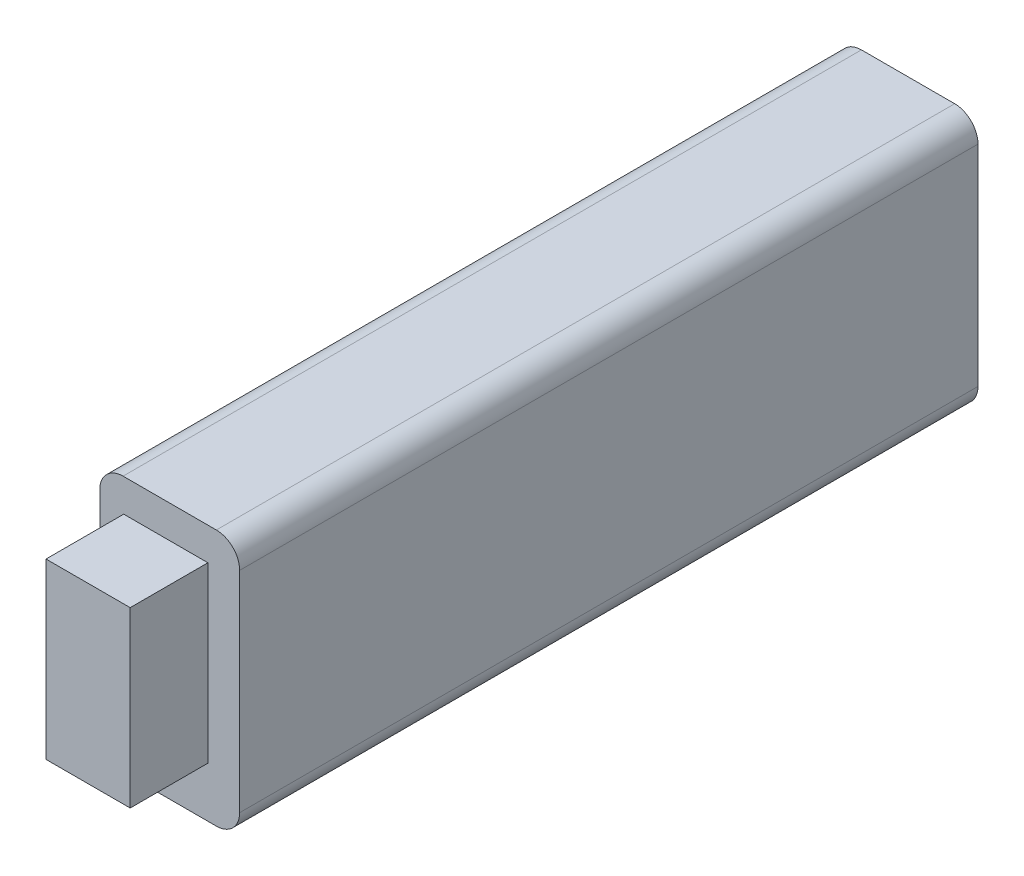
ISO-10303-21;
HEADER;
FILE_DESCRIPTION(('STEP AP214'),'2;1');
FILE_NAME('part.step','',(''),(''),'','','');
FILE_SCHEMA(('AUTOMOTIVE_DESIGN { 1 0 10303 214 1 1 1 1 }'));
ENDSEC;
DATA;
#1=APPLICATION_CONTEXT('core data for automotive mechanical design processes');
#2=APPLICATION_PROTOCOL_DEFINITION('international standard','automotive_design',2000,#1);
#3=PRODUCT_CONTEXT('',#1,'mechanical');
#4=PRODUCT('Part','Part','',(#3));
#5=PRODUCT_RELATED_PRODUCT_CATEGORY('part','',(#4));
#6=PRODUCT_DEFINITION_FORMATION('','',#4);
#7=PRODUCT_DEFINITION_CONTEXT('part definition',#1,'design');
#8=PRODUCT_DEFINITION('design','',#6,#7);
#9=PRODUCT_DEFINITION_SHAPE('','',#8);
#10=(LENGTH_UNIT() NAMED_UNIT(*) SI_UNIT(.MILLI.,.METRE.));
#11=(NAMED_UNIT(*) PLANE_ANGLE_UNIT() SI_UNIT($,.RADIAN.));
#12=(NAMED_UNIT(*) SI_UNIT($,.STERADIAN.) SOLID_ANGLE_UNIT());
#13=UNCERTAINTY_MEASURE_WITH_UNIT(LENGTH_MEASURE(1.E-05),#10,'distance_accuracy_value','');
#14=(GEOMETRIC_REPRESENTATION_CONTEXT(3) GLOBAL_UNCERTAINTY_ASSIGNED_CONTEXT((#13)) GLOBAL_UNIT_ASSIGNED_CONTEXT((#10,
#11,#12)) REPRESENTATION_CONTEXT('',''));
#15=CARTESIAN_POINT('',(0.,0.,0.));
#16=DIRECTION('',(0.,0.,1.));
#17=DIRECTION('',(1.,0.,0.));
#18=AXIS2_PLACEMENT_3D('',#15,#16,#17);
#19=CARTESIAN_POINT('',(18.,-16.5,47.5));
#20=DIRECTION('',(0.,0.,-1.));
#21=DIRECTION('',(-1.,0.,0.));
#22=AXIS2_PLACEMENT_3D('',#19,#20,#21);
#23=PLANE('',#22);
#24=DIRECTION('',(-1.,0.,0.));
#25=VECTOR('',#24,1.);
#26=CARTESIAN_POINT('',(18.,16.5,47.5));
#27=LINE('',#26,#25);
#28=CARTESIAN_POINT('',(15.,16.5,47.5));
#29=VERTEX_POINT('',#28);
#30=CARTESIAN_POINT('',(3.,16.5,47.5));
#31=VERTEX_POINT('',#30);
#32=EDGE_CURVE('E180',#29,#31,#27,.T.);
#33=ORIENTED_EDGE('',*,*,#32,.T.);
#34=CARTESIAN_POINT('',(3.,13.5,47.5));
#35=DIRECTION('',(0.,0.,-1.));
#36=DIRECTION('',(-1.,0.,0.));
#37=AXIS2_PLACEMENT_3D('',#34,#35,#36);
#38=CIRCLE('',#37,3.);
#39=CARTESIAN_POINT('',(0.,13.5,47.5));
#40=VERTEX_POINT('',#39);
#41=EDGE_CURVE('E197',#31,#40,#38,.F.);
#42=ORIENTED_EDGE('',*,*,#41,.T.);
#43=DIRECTION('',(0.,-1.,0.));
#44=VECTOR('',#43,1.);
#45=CARTESIAN_POINT('',(0.,-16.5,47.5));
#46=LINE('',#45,#44);
#47=CARTESIAN_POINT('',(0.,-13.5,47.5));
#48=VERTEX_POINT('',#47);
#49=EDGE_CURVE('E161',#40,#48,#46,.T.);
#50=ORIENTED_EDGE('',*,*,#49,.T.);
#51=CARTESIAN_POINT('',(3.,-13.5,47.5));
#52=DIRECTION('',(0.,0.,-1.));
#53=DIRECTION('',(-1.,0.,0.));
#54=AXIS2_PLACEMENT_3D('',#51,#52,#53);
#55=CIRCLE('',#54,3.);
#56=CARTESIAN_POINT('',(3.,-16.5,47.5));
#57=VERTEX_POINT('',#56);
#58=EDGE_CURVE('E191',#48,#57,#55,.F.);
#59=ORIENTED_EDGE('',*,*,#58,.T.);
#60=DIRECTION('',(-1.,0.,0.));
#61=VECTOR('',#60,1.);
#62=CARTESIAN_POINT('',(18.,-16.5,47.5));
#63=LINE('',#62,#61);
#64=CARTESIAN_POINT('',(15.,-16.5,47.5));
#65=VERTEX_POINT('',#64);
#66=EDGE_CURVE('E177',#65,#57,#63,.T.);
#67=ORIENTED_EDGE('',*,*,#66,.F.);
#68=CARTESIAN_POINT('',(15.,-13.5,47.5));
#69=DIRECTION('',(0.,0.,-1.));
#70=DIRECTION('',(-1.,0.,0.));
#71=AXIS2_PLACEMENT_3D('',#68,#69,#70);
#72=CIRCLE('',#71,3.);
#73=CARTESIAN_POINT('',(18.,-13.5,47.5));
#74=VERTEX_POINT('',#73);
#75=EDGE_CURVE('E193',#65,#74,#72,.F.);
#76=ORIENTED_EDGE('',*,*,#75,.T.);
#77=DIRECTION('',(0.,-1.,0.));
#78=VECTOR('',#77,1.);
#79=CARTESIAN_POINT('',(18.,-16.5,47.5));
#80=LINE('',#79,#78);
#81=CARTESIAN_POINT('',(18.,13.5,47.5));
#82=VERTEX_POINT('',#81);
#83=EDGE_CURVE('E168',#82,#74,#80,.T.);
#84=ORIENTED_EDGE('',*,*,#83,.F.);
#85=CARTESIAN_POINT('',(15.,13.5,47.5));
#86=DIRECTION('',(0.,0.,-1.));
#87=DIRECTION('',(-1.,0.,0.));
#88=AXIS2_PLACEMENT_3D('',#85,#86,#87);
#89=CIRCLE('',#88,3.);
#90=EDGE_CURVE('E192',#82,#29,#89,.F.);
#91=ORIENTED_EDGE('',*,*,#90,.T.);
#92=EDGE_LOOP('',(#33,#42,#50,#59,#67,#76,#84,#91));
#93=FACE_BOUND('',#92,.T.);
#94=DIRECTION('',(0.,-1.,0.));
#95=VECTOR('',#94,1.);
#96=CARTESIAN_POINT('',(3.08240215443334,12.3054774625952,47.5));
#97=LINE('',#96,#95);
#98=CARTESIAN_POINT('',(3.08240215443334,12.3054774625952,47.5));
#99=VERTEX_POINT('',#98);
#100=CARTESIAN_POINT('',(3.08240215443334,-10.0262530738284,47.5));
#101=VERTEX_POINT('',#100);
#102=EDGE_CURVE('E160',#99,#101,#97,.T.);
#103=ORIENTED_EDGE('',*,*,#102,.F.);
#104=DIRECTION('',(-1.,0.,0.));
#105=VECTOR('',#104,1.);
#106=CARTESIAN_POINT('',(3.08240215443334,12.3054774625952,47.5));
#107=LINE('',#106,#105);
#108=CARTESIAN_POINT('',(13.9142508564305,12.3054774625952,47.5));
#109=VERTEX_POINT('',#108);
#110=EDGE_CURVE('E152',#109,#99,#107,.T.);
#111=ORIENTED_EDGE('',*,*,#110,.F.);
#112=DIRECTION('',(0.,1.,0.));
#113=VECTOR('',#112,1.);
#114=CARTESIAN_POINT('',(13.9142508564305,12.3054774625952,47.5));
#115=LINE('',#114,#113);
#116=CARTESIAN_POINT('',(13.9142508564305,-10.0262530738284,47.5));
#117=VERTEX_POINT('',#116);
#118=EDGE_CURVE('E373',#117,#109,#115,.T.);
#119=ORIENTED_EDGE('',*,*,#118,.F.);
#120=DIRECTION('',(1.,0.,0.));
#121=VECTOR('',#120,1.);
#122=CARTESIAN_POINT('',(3.08240215443334,-10.0262530738284,47.5));
#123=LINE('',#122,#121);
#124=EDGE_CURVE('E377',#101,#117,#123,.T.);
#125=ORIENTED_EDGE('',*,*,#124,.F.);
#126=EDGE_LOOP('',(#103,#111,#119,#125));
#127=FACE_BOUND('',#126,.T.);
#128=ADVANCED_FACE('F45',(#93,#127),#23,.F.);
#129=CARTESIAN_POINT('',(18.,-16.5,-47.5));
#130=DIRECTION('',(0.,0.,1.));
#131=DIRECTION('',(1.,0.,0.));
#132=AXIS2_PLACEMENT_3D('',#129,#130,#131);
#133=PLANE('',#132);
#134=DIRECTION('',(0.,1.,0.));
#135=VECTOR('',#134,1.);
#136=CARTESIAN_POINT('',(0.,-16.5,-47.5));
#137=LINE('',#136,#135);
#138=CARTESIAN_POINT('',(0.,-13.5,-47.5));
#139=VERTEX_POINT('',#138);
#140=CARTESIAN_POINT('',(0.,13.5,-47.5));
#141=VERTEX_POINT('',#140);
#142=EDGE_CURVE('E158',#139,#141,#137,.T.);
#143=ORIENTED_EDGE('',*,*,#142,.T.);
#144=CARTESIAN_POINT('',(3.,13.5,-47.5));
#145=DIRECTION('',(0.,0.,1.));
#146=DIRECTION('',(1.,0.,0.));
#147=AXIS2_PLACEMENT_3D('',#144,#145,#146);
#148=CIRCLE('',#147,3.);
#149=CARTESIAN_POINT('',(3.,16.5,-47.5));
#150=VERTEX_POINT('',#149);
#151=EDGE_CURVE('E210',#141,#150,#148,.F.);
#152=ORIENTED_EDGE('',*,*,#151,.T.);
#153=DIRECTION('',(-1.,0.,0.));
#154=VECTOR('',#153,1.);
#155=CARTESIAN_POINT('',(18.,16.5,-47.5));
#156=LINE('',#155,#154);
#157=CARTESIAN_POINT('',(15.,16.5,-47.5));
#158=VERTEX_POINT('',#157);
#159=EDGE_CURVE('E181',#158,#150,#156,.T.);
#160=ORIENTED_EDGE('',*,*,#159,.F.);
#161=CARTESIAN_POINT('',(15.,13.5,-47.5));
#162=DIRECTION('',(0.,0.,1.));
#163=DIRECTION('',(1.,0.,0.));
#164=AXIS2_PLACEMENT_3D('',#161,#162,#163);
#165=CIRCLE('',#164,3.);
#166=CARTESIAN_POINT('',(18.,13.5,-47.5));
#167=VERTEX_POINT('',#166);
#168=EDGE_CURVE('E204',#158,#167,#165,.F.);
#169=ORIENTED_EDGE('',*,*,#168,.T.);
#170=DIRECTION('',(0.,1.,0.));
#171=VECTOR('',#170,1.);
#172=CARTESIAN_POINT('',(18.,-16.5,-47.5));
#173=LINE('',#172,#171);
#174=CARTESIAN_POINT('',(18.,-13.5,-47.5));
#175=VERTEX_POINT('',#174);
#176=EDGE_CURVE('E170',#175,#167,#173,.T.);
#177=ORIENTED_EDGE('',*,*,#176,.F.);
#178=CARTESIAN_POINT('',(15.,-13.5,-47.5));
#179=DIRECTION('',(0.,0.,1.));
#180=DIRECTION('',(1.,0.,0.));
#181=AXIS2_PLACEMENT_3D('',#178,#179,#180);
#182=CIRCLE('',#181,3.);
#183=CARTESIAN_POINT('',(15.,-16.5,-47.5));
#184=VERTEX_POINT('',#183);
#185=EDGE_CURVE('E62',#175,#184,#182,.F.);
#186=ORIENTED_EDGE('',*,*,#185,.T.);
#187=DIRECTION('',(-1.,0.,0.));
#188=VECTOR('',#187,1.);
#189=CARTESIAN_POINT('',(18.,-16.5,-47.5));
#190=LINE('',#189,#188);
#191=CARTESIAN_POINT('',(3.,-16.5,-47.5));
#192=VERTEX_POINT('',#191);
#193=EDGE_CURVE('E171',#184,#192,#190,.T.);
#194=ORIENTED_EDGE('',*,*,#193,.T.);
#195=CARTESIAN_POINT('',(3.,-13.5,-47.5));
#196=DIRECTION('',(0.,0.,1.));
#197=DIRECTION('',(1.,0.,0.));
#198=AXIS2_PLACEMENT_3D('',#195,#196,#197);
#199=CIRCLE('',#198,3.);
#200=EDGE_CURVE('E60',#192,#139,#199,.F.);
#201=ORIENTED_EDGE('',*,*,#200,.T.);
#202=EDGE_LOOP('',(#143,#152,#160,#169,#177,#186,#194,#201));
#203=FACE_BOUND('',#202,.T.);
#204=ADVANCED_FACE('F219',(#203),#133,.F.);
#205=CARTESIAN_POINT('',(18.,16.5,47.5));
#206=DIRECTION('',(0.,-1.,0.));
#207=DIRECTION('',(0.,0.,-1.));
#208=AXIS2_PLACEMENT_3D('',#205,#206,#207);
#209=PLANE('',#208);
#210=ORIENTED_EDGE('',*,*,#159,.T.);
#211=DIRECTION('',(0.,0.,1.));
#212=VECTOR('',#211,1.);
#213=CARTESIAN_POINT('',(3.,16.5,47.5));
#214=LINE('',#213,#212);
#215=EDGE_CURVE('E190',#150,#31,#214,.T.);
#216=ORIENTED_EDGE('',*,*,#215,.T.);
#217=ORIENTED_EDGE('',*,*,#32,.F.);
#218=DIRECTION('',(0.,0.,1.));
#219=VECTOR('',#218,1.);
#220=CARTESIAN_POINT('',(15.,16.5,47.5));
#221=LINE('',#220,#219);
#222=EDGE_CURVE('E189',#29,#158,#221,.F.);
#223=ORIENTED_EDGE('',*,*,#222,.T.);
#224=EDGE_LOOP('',(#210,#216,#217,#223));
#225=FACE_BOUND('',#224,.T.);
#226=ADVANCED_FACE('F242',(#225),#209,.F.);
#227=CARTESIAN_POINT('',(18.,-16.5,47.5));
#228=DIRECTION('',(0.,1.,0.));
#229=DIRECTION('',(0.,0.,1.));
#230=AXIS2_PLACEMENT_3D('',#227,#228,#229);
#231=PLANE('',#230);
#232=ORIENTED_EDGE('',*,*,#66,.T.);
#233=DIRECTION('',(0.,0.,-1.));
#234=VECTOR('',#233,1.);
#235=CARTESIAN_POINT('',(3.,-16.5,-47.5));
#236=LINE('',#235,#234);
#237=EDGE_CURVE('E211',#57,#192,#236,.T.);
#238=ORIENTED_EDGE('',*,*,#237,.T.);
#239=ORIENTED_EDGE('',*,*,#193,.F.);
#240=DIRECTION('',(0.,0.,-1.));
#241=VECTOR('',#240,1.);
#242=CARTESIAN_POINT('',(15.,-16.5,47.5));
#243=LINE('',#242,#241);
#244=EDGE_CURVE('E207',#184,#65,#243,.F.);
#245=ORIENTED_EDGE('',*,*,#244,.T.);
#246=EDGE_LOOP('',(#232,#238,#239,#245));
#247=FACE_BOUND('',#246,.T.);
#248=ADVANCED_FACE('F232',(#247),#231,.F.);
#249=CARTESIAN_POINT('',(18.,0.,0.));
#250=DIRECTION('',(-1.,0.,0.));
#251=DIRECTION('',(0.,0.,1.));
#252=AXIS2_PLACEMENT_3D('',#249,#250,#251);
#253=PLANE('',#252);
#254=ORIENTED_EDGE('',*,*,#176,.T.);
#255=DIRECTION('',(0.,0.,1.));
#256=VECTOR('',#255,1.);
#257=CARTESIAN_POINT('',(18.,13.5,0.));
#258=LINE('',#257,#256);
#259=EDGE_CURVE('E11',#167,#82,#258,.T.);
#260=ORIENTED_EDGE('',*,*,#259,.T.);
#261=ORIENTED_EDGE('',*,*,#83,.T.);
#262=DIRECTION('',(0.,0.,-1.));
#263=VECTOR('',#262,1.);
#264=CARTESIAN_POINT('',(18.,-13.5,0.));
#265=LINE('',#264,#263);
#266=EDGE_CURVE('E49',#74,#175,#265,.T.);
#267=ORIENTED_EDGE('',*,*,#266,.T.);
#268=EDGE_LOOP('',(#254,#260,#261,#267));
#269=FACE_BOUND('',#268,.T.);
#270=ADVANCED_FACE('F214',(#269),#253,.F.);
#271=CARTESIAN_POINT('',(0.,0.,0.));
#272=DIRECTION('',(-1.,0.,0.));
#273=DIRECTION('',(0.,0.,1.));
#274=AXIS2_PLACEMENT_3D('',#271,#272,#273);
#275=PLANE('',#274);
#276=ORIENTED_EDGE('',*,*,#49,.F.);
#277=DIRECTION('',(0.,0.,1.));
#278=VECTOR('',#277,1.);
#279=CARTESIAN_POINT('',(0.,13.5,-47.5));
#280=LINE('',#279,#278);
#281=EDGE_CURVE('E203',#40,#141,#280,.F.);
#282=ORIENTED_EDGE('',*,*,#281,.T.);
#283=ORIENTED_EDGE('',*,*,#142,.F.);
#284=DIRECTION('',(0.,0.,-1.));
#285=VECTOR('',#284,1.);
#286=CARTESIAN_POINT('',(0.,-13.5,47.5));
#287=LINE('',#286,#285);
#288=EDGE_CURVE('E200',#139,#48,#287,.F.);
#289=ORIENTED_EDGE('',*,*,#288,.T.);
#290=EDGE_LOOP('',(#276,#282,#283,#289));
#291=FACE_BOUND('',#290,.T.);
#292=ADVANCED_FACE('F240',(#291),#275,.T.);
#293=CARTESIAN_POINT('',(3.08240215443334,12.3054774625952,57.5));
#294=DIRECTION('',(1.,0.,0.));
#295=DIRECTION('',(0.,0.,-1.));
#296=AXIS2_PLACEMENT_3D('',#293,#294,#295);
#297=PLANE('',#296);
#298=ORIENTED_EDGE('',*,*,#102,.T.);
#299=DIRECTION('',(0.,0.,-1.));
#300=VECTOR('',#299,1.);
#301=CARTESIAN_POINT('',(3.08240215443334,-10.0262530738284,57.5));
#302=LINE('',#301,#300);
#303=CARTESIAN_POINT('',(3.08240215443334,-10.0262530738284,57.5));
#304=VERTEX_POINT('',#303);
#305=EDGE_CURVE('E137',#304,#101,#302,.T.);
#306=ORIENTED_EDGE('',*,*,#305,.F.);
#307=DIRECTION('',(0.,-1.,0.));
#308=VECTOR('',#307,1.);
#309=CARTESIAN_POINT('',(3.08240215443334,12.3054774625952,57.5));
#310=LINE('',#309,#308);
#311=CARTESIAN_POINT('',(3.08240215443334,12.3054774625952,57.5));
#312=VERTEX_POINT('',#311);
#313=EDGE_CURVE('E144',#312,#304,#310,.T.);
#314=ORIENTED_EDGE('',*,*,#313,.F.);
#315=DIRECTION('',(0.,0.,-1.));
#316=VECTOR('',#315,1.);
#317=CARTESIAN_POINT('',(3.08240215443334,12.3054774625952,57.5));
#318=LINE('',#317,#316);
#319=EDGE_CURVE('E367',#312,#99,#318,.T.);
#320=ORIENTED_EDGE('',*,*,#319,.T.);
#321=EDGE_LOOP('',(#298,#306,#314,#320));
#322=FACE_BOUND('',#321,.T.);
#323=ADVANCED_FACE('F156',(#322),#297,.F.);
#324=CARTESIAN_POINT('',(3.08240215443334,-10.0262530738284,57.5));
#325=DIRECTION('',(0.,1.,0.));
#326=DIRECTION('',(0.,0.,1.));
#327=AXIS2_PLACEMENT_3D('',#324,#325,#326);
#328=PLANE('',#327);
#329=ORIENTED_EDGE('',*,*,#124,.T.);
#330=DIRECTION('',(0.,0.,-1.));
#331=VECTOR('',#330,1.);
#332=CARTESIAN_POINT('',(13.9142508564305,-10.0262530738284,57.5));
#333=LINE('',#332,#331);
#334=CARTESIAN_POINT('',(13.9142508564305,-10.0262530738284,57.5));
#335=VERTEX_POINT('',#334);
#336=EDGE_CURVE('E143',#335,#117,#333,.T.);
#337=ORIENTED_EDGE('',*,*,#336,.F.);
#338=DIRECTION('',(1.,0.,0.));
#339=VECTOR('',#338,1.);
#340=CARTESIAN_POINT('',(3.08240215443334,-10.0262530738284,57.5));
#341=LINE('',#340,#339);
#342=EDGE_CURVE('E135',#304,#335,#341,.T.);
#343=ORIENTED_EDGE('',*,*,#342,.F.);
#344=ORIENTED_EDGE('',*,*,#305,.T.);
#345=EDGE_LOOP('',(#329,#337,#343,#344));
#346=FACE_BOUND('',#345,.T.);
#347=ADVANCED_FACE('F138',(#346),#328,.F.);
#348=CARTESIAN_POINT('',(13.9142508564305,12.3054774625952,57.5));
#349=DIRECTION('',(-1.,0.,0.));
#350=DIRECTION('',(0.,0.,1.));
#351=AXIS2_PLACEMENT_3D('',#348,#349,#350);
#352=PLANE('',#351);
#353=ORIENTED_EDGE('',*,*,#118,.T.);
#354=DIRECTION('',(0.,0.,-1.));
#355=VECTOR('',#354,1.);
#356=CARTESIAN_POINT('',(13.9142508564305,12.3054774625952,57.5));
#357=LINE('',#356,#355);
#358=CARTESIAN_POINT('',(13.9142508564305,12.3054774625952,57.5));
#359=VERTEX_POINT('',#358);
#360=EDGE_CURVE('E162',#359,#109,#357,.T.);
#361=ORIENTED_EDGE('',*,*,#360,.F.);
#362=DIRECTION('',(0.,1.,0.));
#363=VECTOR('',#362,1.);
#364=CARTESIAN_POINT('',(13.9142508564305,12.3054774625952,57.5));
#365=LINE('',#364,#363);
#366=EDGE_CURVE('E145',#335,#359,#365,.T.);
#367=ORIENTED_EDGE('',*,*,#366,.F.);
#368=ORIENTED_EDGE('',*,*,#336,.T.);
#369=EDGE_LOOP('',(#353,#361,#367,#368));
#370=FACE_BOUND('',#369,.T.);
#371=ADVANCED_FACE('F268',(#370),#352,.F.);
#372=CARTESIAN_POINT('',(3.08240215443334,12.3054774625952,57.5));
#373=DIRECTION('',(0.,-1.,0.));
#374=DIRECTION('',(0.,0.,-1.));
#375=AXIS2_PLACEMENT_3D('',#372,#373,#374);
#376=PLANE('',#375);
#377=ORIENTED_EDGE('',*,*,#110,.T.);
#378=ORIENTED_EDGE('',*,*,#319,.F.);
#379=DIRECTION('',(-1.,0.,0.));
#380=VECTOR('',#379,1.);
#381=CARTESIAN_POINT('',(3.08240215443334,12.3054774625952,57.5));
#382=LINE('',#381,#380);
#383=EDGE_CURVE('E147',#359,#312,#382,.T.);
#384=ORIENTED_EDGE('',*,*,#383,.F.);
#385=ORIENTED_EDGE('',*,*,#360,.T.);
#386=EDGE_LOOP('',(#377,#378,#384,#385));
#387=FACE_BOUND('',#386,.T.);
#388=ADVANCED_FACE('F271',(#387),#376,.F.);
#389=CARTESIAN_POINT('',(0.,0.,57.5));
#390=DIRECTION('',(0.,0.,1.));
#391=DIRECTION('',(1.,0.,0.));
#392=AXIS2_PLACEMENT_3D('',#389,#390,#391);
#393=PLANE('',#392);
#394=ORIENTED_EDGE('',*,*,#313,.T.);
#395=ORIENTED_EDGE('',*,*,#342,.T.);
#396=ORIENTED_EDGE('',*,*,#366,.T.);
#397=ORIENTED_EDGE('',*,*,#383,.T.);
#398=EDGE_LOOP('',(#394,#395,#396,#397));
#399=FACE_BOUND('',#398,.T.);
#400=ADVANCED_FACE('F146',(#399),#393,.T.);
#401=CARTESIAN_POINT('',(3.,13.5,47.5));
#402=DIRECTION('',(0.,0.,-1.));
#403=DIRECTION('',(-1.,0.,0.));
#404=AXIS2_PLACEMENT_3D('',#401,#402,#403);
#405=CYLINDRICAL_SURFACE('',#404,3.);
#406=ORIENTED_EDGE('',*,*,#151,.F.);
#407=ORIENTED_EDGE('',*,*,#281,.F.);
#408=ORIENTED_EDGE('',*,*,#41,.F.);
#409=ORIENTED_EDGE('',*,*,#215,.F.);
#410=EDGE_LOOP('',(#406,#407,#408,#409));
#411=FACE_BOUND('',#410,.T.);
#412=ADVANCED_FACE('F241',(#411),#405,.T.);
#413=CARTESIAN_POINT('',(3.,-13.5,47.5));
#414=DIRECTION('',(0.,0.,1.));
#415=DIRECTION('',(1.,0.,0.));
#416=AXIS2_PLACEMENT_3D('',#413,#414,#415);
#417=CYLINDRICAL_SURFACE('',#416,3.);
#418=ORIENTED_EDGE('',*,*,#58,.F.);
#419=ORIENTED_EDGE('',*,*,#288,.F.);
#420=ORIENTED_EDGE('',*,*,#200,.F.);
#421=ORIENTED_EDGE('',*,*,#237,.F.);
#422=EDGE_LOOP('',(#418,#419,#420,#421));
#423=FACE_BOUND('',#422,.T.);
#424=ADVANCED_FACE('F238',(#423),#417,.T.);
#425=CARTESIAN_POINT('',(15.,13.5,0.));
#426=DIRECTION('',(0.,0.,1.));
#427=DIRECTION('',(1.,0.,0.));
#428=AXIS2_PLACEMENT_3D('',#425,#426,#427);
#429=CYLINDRICAL_SURFACE('',#428,3.);
#430=ORIENTED_EDGE('',*,*,#168,.F.);
#431=ORIENTED_EDGE('',*,*,#222,.F.);
#432=ORIENTED_EDGE('',*,*,#90,.F.);
#433=ORIENTED_EDGE('',*,*,#259,.F.);
#434=EDGE_LOOP('',(#430,#431,#432,#433));
#435=FACE_BOUND('',#434,.T.);
#436=ADVANCED_FACE('F223',(#435),#429,.T.);
#437=CARTESIAN_POINT('',(15.,-13.5,0.));
#438=DIRECTION('',(0.,0.,-1.));
#439=DIRECTION('',(-1.,0.,0.));
#440=AXIS2_PLACEMENT_3D('',#437,#438,#439);
#441=CYLINDRICAL_SURFACE('',#440,3.);
#442=ORIENTED_EDGE('',*,*,#75,.F.);
#443=ORIENTED_EDGE('',*,*,#244,.F.);
#444=ORIENTED_EDGE('',*,*,#185,.F.);
#445=ORIENTED_EDGE('',*,*,#266,.F.);
#446=EDGE_LOOP('',(#442,#443,#444,#445));
#447=FACE_BOUND('',#446,.T.);
#448=ADVANCED_FACE('F42',(#447),#441,.T.);
#449=CLOSED_SHELL('',(#128,#204,#226,#248,#270,#292,#323,#347,#371,#388,#400,#412,#424,#436,#448));
#450=MANIFOLD_SOLID_BREP('B2',#449);
#451=ADVANCED_BREP_SHAPE_REPRESENTATION('',(#18,#450),#14);
#452=SHAPE_DEFINITION_REPRESENTATION(#9,#451);
ENDSEC;
END-ISO-10303-21;
